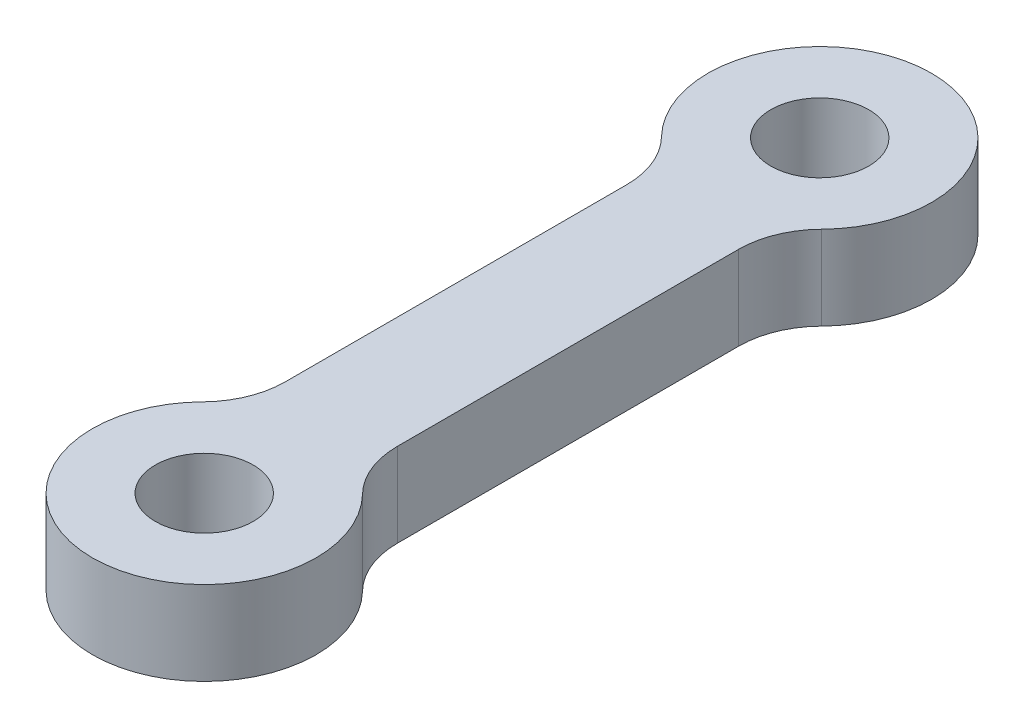
ISO-10303-21;
HEADER;
FILE_DESCRIPTION(('STEP AP214'),'2;1');
FILE_NAME('part.step','',(''),(''),'','','');
FILE_SCHEMA(('AUTOMOTIVE_DESIGN { 1 0 10303 214 1 1 1 1 }'));
ENDSEC;
DATA;
#1=APPLICATION_CONTEXT('core data for automotive mechanical design processes');
#2=APPLICATION_PROTOCOL_DEFINITION('international standard','automotive_design',2000,#1);
#3=PRODUCT_CONTEXT('',#1,'mechanical');
#4=PRODUCT('Part','Part','',(#3));
#5=PRODUCT_RELATED_PRODUCT_CATEGORY('part','',(#4));
#6=PRODUCT_DEFINITION_FORMATION('','',#4);
#7=PRODUCT_DEFINITION_CONTEXT('part definition',#1,'design');
#8=PRODUCT_DEFINITION('design','',#6,#7);
#9=PRODUCT_DEFINITION_SHAPE('','',#8);
#10=(LENGTH_UNIT() NAMED_UNIT(*) SI_UNIT(.MILLI.,.METRE.));
#11=(NAMED_UNIT(*) PLANE_ANGLE_UNIT() SI_UNIT($,.RADIAN.));
#12=(NAMED_UNIT(*) SI_UNIT($,.STERADIAN.) SOLID_ANGLE_UNIT());
#13=UNCERTAINTY_MEASURE_WITH_UNIT(LENGTH_MEASURE(1.E-05),#10,'distance_accuracy_value','');
#14=(GEOMETRIC_REPRESENTATION_CONTEXT(3) GLOBAL_UNCERTAINTY_ASSIGNED_CONTEXT((#13)) GLOBAL_UNIT_ASSIGNED_CONTEXT((#10,
#11,#12)) REPRESENTATION_CONTEXT('',''));
#15=CARTESIAN_POINT('',(0.,0.,0.));
#16=DIRECTION('',(0.,0.,1.));
#17=DIRECTION('',(1.,0.,0.));
#18=AXIS2_PLACEMENT_3D('',#15,#16,#17);
#19=CARTESIAN_POINT('',(2.,0.,0.));
#20=DIRECTION('',(1.,0.,0.));
#21=DIRECTION('',(0.,0.,-1.));
#22=AXIS2_PLACEMENT_3D('',#19,#20,#21);
#23=PLANE('',#22);
#24=DIRECTION('',(0.,0.,-1.));
#25=VECTOR('',#24,1.);
#26=CARTESIAN_POINT('',(2.,3.,0.));
#27=LINE('',#26,#25);
#28=CARTESIAN_POINT('',(2.,3.,-4.89897948556636));
#29=VERTEX_POINT('',#28);
#30=CARTESIAN_POINT('',(2.,3.,-17.1010205144336));
#31=VERTEX_POINT('',#30);
#32=EDGE_CURVE('E164',#29,#31,#27,.T.);
#33=ORIENTED_EDGE('',*,*,#32,.F.);
#34=DIRECTION('',(0.,-1.,0.));
#35=VECTOR('',#34,1.);
#36=CARTESIAN_POINT('',(2.,0.,-4.89897948556636));
#37=LINE('',#36,#35);
#38=CARTESIAN_POINT('',(2.,0.,-4.89897948556636));
#39=VERTEX_POINT('',#38);
#40=EDGE_CURVE('E138',#29,#39,#37,.T.);
#41=ORIENTED_EDGE('',*,*,#40,.T.);
#42=DIRECTION('',(0.,0.,-1.));
#43=VECTOR('',#42,1.);
#44=CARTESIAN_POINT('',(2.,0.,0.));
#45=LINE('',#44,#43);
#46=CARTESIAN_POINT('',(2.,0.,-17.1010205144336));
#47=VERTEX_POINT('',#46);
#48=EDGE_CURVE('E130',#39,#47,#45,.T.);
#49=ORIENTED_EDGE('',*,*,#48,.T.);
#50=DIRECTION('',(0.,-1.,0.));
#51=VECTOR('',#50,1.);
#52=CARTESIAN_POINT('',(2.,0.,-17.1010205144336));
#53=LINE('',#52,#51);
#54=EDGE_CURVE('E135',#47,#31,#53,.F.);
#55=ORIENTED_EDGE('',*,*,#54,.T.);
#56=EDGE_LOOP('',(#33,#41,#49,#55));
#57=FACE_BOUND('',#56,.T.);
#58=ADVANCED_FACE('F35',(#57),#23,.T.);
#59=CARTESIAN_POINT('',(-2.,0.,0.));
#60=DIRECTION('',(-1.,0.,0.));
#61=DIRECTION('',(0.,0.,1.));
#62=AXIS2_PLACEMENT_3D('',#59,#60,#61);
#63=PLANE('',#62);
#64=DIRECTION('',(0.,0.,1.));
#65=VECTOR('',#64,1.);
#66=CARTESIAN_POINT('',(-2.,0.,0.));
#67=LINE('',#66,#65);
#68=CARTESIAN_POINT('',(-2.,0.,-17.1010205144336));
#69=VERTEX_POINT('',#68);
#70=CARTESIAN_POINT('',(-2.,0.,-4.89897948556636));
#71=VERTEX_POINT('',#70);
#72=EDGE_CURVE('E127',#69,#71,#67,.T.);
#73=ORIENTED_EDGE('',*,*,#72,.T.);
#74=DIRECTION('',(0.,-1.,0.));
#75=VECTOR('',#74,1.);
#76=CARTESIAN_POINT('',(-2.,0.,-4.89897948556636));
#77=LINE('',#76,#75);
#78=CARTESIAN_POINT('',(-2.,3.,-4.89897948556636));
#79=VERTEX_POINT('',#78);
#80=EDGE_CURVE('E104',#71,#79,#77,.F.);
#81=ORIENTED_EDGE('',*,*,#80,.T.);
#82=DIRECTION('',(0.,0.,1.));
#83=VECTOR('',#82,1.);
#84=CARTESIAN_POINT('',(-2.,3.,0.));
#85=LINE('',#84,#83);
#86=CARTESIAN_POINT('',(-2.,3.,-17.1010205144336));
#87=VERTEX_POINT('',#86);
#88=EDGE_CURVE('E158',#87,#79,#85,.T.);
#89=ORIENTED_EDGE('',*,*,#88,.F.);
#90=DIRECTION('',(0.,-1.,0.));
#91=VECTOR('',#90,1.);
#92=CARTESIAN_POINT('',(-2.,0.,-17.1010205144336));
#93=LINE('',#92,#91);
#94=EDGE_CURVE('E140',#87,#69,#93,.T.);
#95=ORIENTED_EDGE('',*,*,#94,.T.);
#96=EDGE_LOOP('',(#73,#81,#89,#95));
#97=FACE_BOUND('',#96,.T.);
#98=ADVANCED_FACE('F163',(#97),#63,.T.);
#99=CARTESIAN_POINT('',(0.,3.,0.));
#100=DIRECTION('',(0.,-1.,0.));
#101=DIRECTION('',(0.,0.,-1.));
#102=AXIS2_PLACEMENT_3D('',#99,#100,#101);
#103=CYLINDRICAL_SURFACE('',#102,4.);
#104=CARTESIAN_POINT('',(0.,0.,0.));
#105=DIRECTION('',(0.,1.,0.));
#106=DIRECTION('',(0.,0.,1.));
#107=AXIS2_PLACEMENT_3D('',#104,#105,#106);
#108=CIRCLE('',#107,4.);
#109=CARTESIAN_POINT('',(-2.85714285714286,0.,-2.79941684889506));
#110=VERTEX_POINT('',#109);
#111=CARTESIAN_POINT('',(2.85714285714286,0.,-2.79941684889506));
#112=VERTEX_POINT('',#111);
#113=EDGE_CURVE('E117',#110,#112,#108,.T.);
#114=ORIENTED_EDGE('',*,*,#113,.T.);
#115=DIRECTION('',(0.,-1.,0.));
#116=VECTOR('',#115,1.);
#117=CARTESIAN_POINT('',(2.85714285714286,3.,-2.79941684889506));
#118=LINE('',#117,#116);
#119=CARTESIAN_POINT('',(2.85714285714286,3.,-2.79941684889506));
#120=VERTEX_POINT('',#119);
#121=EDGE_CURVE('E121',#112,#120,#118,.F.);
#122=ORIENTED_EDGE('',*,*,#121,.T.);
#123=CARTESIAN_POINT('',(0.,3.,0.));
#124=DIRECTION('',(0.,1.,0.));
#125=DIRECTION('',(0.,0.,1.));
#126=AXIS2_PLACEMENT_3D('',#123,#124,#125);
#127=CIRCLE('',#126,4.);
#128=CARTESIAN_POINT('',(-2.85714285714286,3.,-2.79941684889506));
#129=VERTEX_POINT('',#128);
#130=EDGE_CURVE('E120',#129,#120,#127,.T.);
#131=ORIENTED_EDGE('',*,*,#130,.F.);
#132=DIRECTION('',(0.,-1.,0.));
#133=VECTOR('',#132,1.);
#134=CARTESIAN_POINT('',(-2.85714285714286,3.,-2.79941684889506));
#135=LINE('',#134,#133);
#136=EDGE_CURVE('E103',#129,#110,#135,.T.);
#137=ORIENTED_EDGE('',*,*,#136,.T.);
#138=EDGE_LOOP('',(#114,#122,#131,#137));
#139=FACE_BOUND('',#138,.T.);
#140=ADVANCED_FACE('F115',(#139),#103,.T.);
#141=CARTESIAN_POINT('',(0.,3.,0.));
#142=DIRECTION('',(0.,1.,0.));
#143=DIRECTION('',(0.,0.,1.));
#144=AXIS2_PLACEMENT_3D('',#141,#142,#143);
#145=PLANE('',#144);
#146=CARTESIAN_POINT('',(0.,3.,0.));
#147=DIRECTION('',(0.,1.,0.));
#148=DIRECTION('',(0.,0.,1.));
#149=AXIS2_PLACEMENT_3D('',#146,#147,#148);
#150=CIRCLE('',#149,1.75);
#151=CARTESIAN_POINT('',(0.,3.,1.75));
#152=VERTEX_POINT('',#151);
#153=EDGE_CURVE('E281',#152,#152,#150,.T.);
#154=ORIENTED_EDGE('',*,*,#153,.F.);
#155=EDGE_LOOP('',(#154));
#156=FACE_BOUND('',#155,.T.);
#157=CARTESIAN_POINT('',(0.,3.,-22.));
#158=DIRECTION('',(0.,1.,0.));
#159=DIRECTION('',(0.,0.,1.));
#160=AXIS2_PLACEMENT_3D('',#157,#158,#159);
#161=CIRCLE('',#160,1.75);
#162=CARTESIAN_POINT('',(0.,3.,-20.25));
#163=VERTEX_POINT('',#162);
#164=EDGE_CURVE('E174',#163,#163,#161,.T.);
#165=ORIENTED_EDGE('',*,*,#164,.F.);
#166=EDGE_LOOP('',(#165));
#167=FACE_BOUND('',#166,.T.);
#168=ORIENTED_EDGE('',*,*,#32,.T.);
#169=CARTESIAN_POINT('',(5.,3.,-17.1010205144336));
#170=DIRECTION('',(0.,1.,0.));
#171=DIRECTION('',(0.,0.,1.));
#172=AXIS2_PLACEMENT_3D('',#169,#170,#171);
#173=CIRCLE('',#172,3.);
#174=CARTESIAN_POINT('',(2.85714285714286,3.,-19.2005831511049));
#175=VERTEX_POINT('',#174);
#176=EDGE_CURVE('E43',#31,#175,#173,.F.);
#177=ORIENTED_EDGE('',*,*,#176,.T.);
#178=CARTESIAN_POINT('',(0.,3.,-22.));
#179=DIRECTION('',(0.,1.,0.));
#180=DIRECTION('',(0.,0.,1.));
#181=AXIS2_PLACEMENT_3D('',#178,#179,#180);
#182=CIRCLE('',#181,4.);
#183=CARTESIAN_POINT('',(-2.85714285714286,3.,-19.2005831511049));
#184=VERTEX_POINT('',#183);
#185=EDGE_CURVE('E159',#175,#184,#182,.T.);
#186=ORIENTED_EDGE('',*,*,#185,.T.);
#187=CARTESIAN_POINT('',(-5.,3.,-17.1010205144336));
#188=DIRECTION('',(0.,1.,0.));
#189=DIRECTION('',(0.,0.,1.));
#190=AXIS2_PLACEMENT_3D('',#187,#188,#189);
#191=CIRCLE('',#190,3.);
#192=EDGE_CURVE('E153',#184,#87,#191,.F.);
#193=ORIENTED_EDGE('',*,*,#192,.T.);
#194=ORIENTED_EDGE('',*,*,#88,.T.);
#195=CARTESIAN_POINT('',(-5.,3.,-4.89897948556636));
#196=DIRECTION('',(0.,1.,0.));
#197=DIRECTION('',(0.,0.,1.));
#198=AXIS2_PLACEMENT_3D('',#195,#196,#197);
#199=CIRCLE('',#198,3.);
#200=EDGE_CURVE('E109',#79,#129,#199,.F.);
#201=ORIENTED_EDGE('',*,*,#200,.T.);
#202=ORIENTED_EDGE('',*,*,#130,.T.);
#203=CARTESIAN_POINT('',(5.,3.,-4.89897948556636));
#204=DIRECTION('',(0.,1.,0.));
#205=DIRECTION('',(0.,0.,1.));
#206=AXIS2_PLACEMENT_3D('',#203,#204,#205);
#207=CIRCLE('',#206,3.);
#208=EDGE_CURVE('E147',#120,#29,#207,.F.);
#209=ORIENTED_EDGE('',*,*,#208,.T.);
#210=EDGE_LOOP('',(#168,#177,#186,#193,#194,#201,#202,#209));
#211=FACE_BOUND('',#210,.T.);
#212=ADVANCED_FACE('F157',(#156,#167,#211),#145,.T.);
#213=CARTESIAN_POINT('',(0.,0.,0.));
#214=DIRECTION('',(0.,1.,0.));
#215=DIRECTION('',(0.,0.,1.));
#216=AXIS2_PLACEMENT_3D('',#213,#214,#215);
#217=PLANE('',#216);
#218=CARTESIAN_POINT('',(0.,0.,0.));
#219=DIRECTION('',(0.,1.,0.));
#220=DIRECTION('',(0.,0.,1.));
#221=AXIS2_PLACEMENT_3D('',#218,#219,#220);
#222=CIRCLE('',#221,1.75);
#223=CARTESIAN_POINT('',(0.,0.,1.75));
#224=VERTEX_POINT('',#223);
#225=EDGE_CURVE('E278',#224,#224,#222,.T.);
#226=ORIENTED_EDGE('',*,*,#225,.T.);
#227=EDGE_LOOP('',(#226));
#228=FACE_BOUND('',#227,.T.);
#229=CARTESIAN_POINT('',(0.,0.,-22.));
#230=DIRECTION('',(0.,1.,0.));
#231=DIRECTION('',(0.,0.,1.));
#232=AXIS2_PLACEMENT_3D('',#229,#230,#231);
#233=CIRCLE('',#232,1.75);
#234=CARTESIAN_POINT('',(0.,0.,-20.25));
#235=VERTEX_POINT('',#234);
#236=EDGE_CURVE('E170',#235,#235,#233,.T.);
#237=ORIENTED_EDGE('',*,*,#236,.T.);
#238=EDGE_LOOP('',(#237));
#239=FACE_BOUND('',#238,.T.);
#240=CARTESIAN_POINT('',(0.,0.,-22.));
#241=DIRECTION('',(0.,1.,0.));
#242=DIRECTION('',(0.,0.,1.));
#243=AXIS2_PLACEMENT_3D('',#240,#241,#242);
#244=CIRCLE('',#243,4.);
#245=CARTESIAN_POINT('',(2.85714285714286,0.,-19.2005831511049));
#246=VERTEX_POINT('',#245);
#247=CARTESIAN_POINT('',(-2.85714285714286,0.,-19.2005831511049));
#248=VERTEX_POINT('',#247);
#249=EDGE_CURVE('E166',#246,#248,#244,.T.);
#250=ORIENTED_EDGE('',*,*,#249,.F.);
#251=CARTESIAN_POINT('',(5.,0.,-17.1010205144336));
#252=DIRECTION('',(0.,1.,0.));
#253=DIRECTION('',(0.,0.,1.));
#254=AXIS2_PLACEMENT_3D('',#251,#252,#253);
#255=CIRCLE('',#254,3.);
#256=EDGE_CURVE('E11',#246,#47,#255,.T.);
#257=ORIENTED_EDGE('',*,*,#256,.T.);
#258=ORIENTED_EDGE('',*,*,#48,.F.);
#259=CARTESIAN_POINT('',(5.,0.,-4.89897948556636));
#260=DIRECTION('',(0.,1.,0.));
#261=DIRECTION('',(0.,0.,1.));
#262=AXIS2_PLACEMENT_3D('',#259,#260,#261);
#263=CIRCLE('',#262,3.);
#264=EDGE_CURVE('E110',#39,#112,#263,.T.);
#265=ORIENTED_EDGE('',*,*,#264,.T.);
#266=ORIENTED_EDGE('',*,*,#113,.F.);
#267=CARTESIAN_POINT('',(-5.,0.,-4.89897948556636));
#268=DIRECTION('',(0.,1.,0.));
#269=DIRECTION('',(0.,0.,1.));
#270=AXIS2_PLACEMENT_3D('',#267,#268,#269);
#271=CIRCLE('',#270,3.);
#272=EDGE_CURVE('E99',#110,#71,#271,.T.);
#273=ORIENTED_EDGE('',*,*,#272,.T.);
#274=ORIENTED_EDGE('',*,*,#72,.F.);
#275=CARTESIAN_POINT('',(-5.,0.,-17.1010205144336));
#276=DIRECTION('',(0.,1.,0.));
#277=DIRECTION('',(0.,0.,1.));
#278=AXIS2_PLACEMENT_3D('',#275,#276,#277);
#279=CIRCLE('',#278,3.);
#280=EDGE_CURVE('E151',#69,#248,#279,.T.);
#281=ORIENTED_EDGE('',*,*,#280,.T.);
#282=EDGE_LOOP('',(#250,#257,#258,#265,#266,#273,#274,#281));
#283=FACE_BOUND('',#282,.T.);
#284=ADVANCED_FACE('F124',(#228,#239,#283),#217,.F.);
#285=CARTESIAN_POINT('',(0.,3.,-22.));
#286=DIRECTION('',(0.,-1.,0.));
#287=DIRECTION('',(0.,0.,-1.));
#288=AXIS2_PLACEMENT_3D('',#285,#286,#287);
#289=CYLINDRICAL_SURFACE('',#288,4.);
#290=ORIENTED_EDGE('',*,*,#249,.T.);
#291=DIRECTION('',(0.,-1.,0.));
#292=VECTOR('',#291,1.);
#293=CARTESIAN_POINT('',(-2.85714285714286,3.,-19.2005831511049));
#294=LINE('',#293,#292);
#295=EDGE_CURVE('E50',#248,#184,#294,.F.);
#296=ORIENTED_EDGE('',*,*,#295,.T.);
#297=ORIENTED_EDGE('',*,*,#185,.F.);
#298=DIRECTION('',(0.,-1.,0.));
#299=VECTOR('',#298,1.);
#300=CARTESIAN_POINT('',(2.85714285714286,3.,-19.2005831511049));
#301=LINE('',#300,#299);
#302=EDGE_CURVE('E144',#175,#246,#301,.T.);
#303=ORIENTED_EDGE('',*,*,#302,.T.);
#304=EDGE_LOOP('',(#290,#296,#297,#303));
#305=FACE_BOUND('',#304,.T.);
#306=ADVANCED_FACE('F168',(#305),#289,.T.);
#307=CARTESIAN_POINT('',(5.,3.,-4.89897948556636));
#308=DIRECTION('',(0.,-1.,0.));
#309=DIRECTION('',(0.,0.,-1.));
#310=AXIS2_PLACEMENT_3D('',#307,#308,#309);
#311=CYLINDRICAL_SURFACE('',#310,3.);
#312=ORIENTED_EDGE('',*,*,#264,.F.);
#313=ORIENTED_EDGE('',*,*,#40,.F.);
#314=ORIENTED_EDGE('',*,*,#208,.F.);
#315=ORIENTED_EDGE('',*,*,#121,.F.);
#316=EDGE_LOOP('',(#312,#313,#314,#315));
#317=FACE_BOUND('',#316,.T.);
#318=ADVANCED_FACE('F185',(#317),#311,.F.);
#319=CARTESIAN_POINT('',(-5.,3.,-4.89897948556636));
#320=DIRECTION('',(0.,-1.,0.));
#321=DIRECTION('',(0.,0.,-1.));
#322=AXIS2_PLACEMENT_3D('',#319,#320,#321);
#323=CYLINDRICAL_SURFACE('',#322,3.);
#324=ORIENTED_EDGE('',*,*,#200,.F.);
#325=ORIENTED_EDGE('',*,*,#80,.F.);
#326=ORIENTED_EDGE('',*,*,#272,.F.);
#327=ORIENTED_EDGE('',*,*,#136,.F.);
#328=EDGE_LOOP('',(#324,#325,#326,#327));
#329=FACE_BOUND('',#328,.T.);
#330=ADVANCED_FACE('F102',(#329),#323,.F.);
#331=CARTESIAN_POINT('',(-5.,3.,-17.1010205144336));
#332=DIRECTION('',(0.,-1.,0.));
#333=DIRECTION('',(0.,0.,-1.));
#334=AXIS2_PLACEMENT_3D('',#331,#332,#333);
#335=CYLINDRICAL_SURFACE('',#334,3.);
#336=ORIENTED_EDGE('',*,*,#192,.F.);
#337=ORIENTED_EDGE('',*,*,#295,.F.);
#338=ORIENTED_EDGE('',*,*,#280,.F.);
#339=ORIENTED_EDGE('',*,*,#94,.F.);
#340=EDGE_LOOP('',(#336,#337,#338,#339));
#341=FACE_BOUND('',#340,.T.);
#342=ADVANCED_FACE('F165',(#341),#335,.F.);
#343=CARTESIAN_POINT('',(5.,3.,-17.1010205144336));
#344=DIRECTION('',(0.,-1.,0.));
#345=DIRECTION('',(0.,0.,-1.));
#346=AXIS2_PLACEMENT_3D('',#343,#344,#345);
#347=CYLINDRICAL_SURFACE('',#346,3.);
#348=ORIENTED_EDGE('',*,*,#256,.F.);
#349=ORIENTED_EDGE('',*,*,#302,.F.);
#350=ORIENTED_EDGE('',*,*,#176,.F.);
#351=ORIENTED_EDGE('',*,*,#54,.F.);
#352=EDGE_LOOP('',(#348,#349,#350,#351));
#353=FACE_BOUND('',#352,.T.);
#354=ADVANCED_FACE('F37',(#353),#347,.F.);
#355=CARTESIAN_POINT('',(0.,0.,-22.));
#356=DIRECTION('',(0.,1.,0.));
#357=DIRECTION('',(0.,0.,1.));
#358=AXIS2_PLACEMENT_3D('',#355,#356,#357);
#359=CYLINDRICAL_SURFACE('',#358,1.75);
#360=ORIENTED_EDGE('',*,*,#236,.F.);
#361=EDGE_LOOP('',(#360));
#362=FACE_BOUND('',#361,.T.);
#363=ORIENTED_EDGE('',*,*,#164,.T.);
#364=EDGE_LOOP('',(#363));
#365=FACE_BOUND('',#364,.T.);
#366=ADVANCED_FACE('F252',(#362,#365),#359,.F.);
#367=CARTESIAN_POINT('',(0.,0.,0.));
#368=DIRECTION('',(0.,1.,0.));
#369=DIRECTION('',(0.,0.,1.));
#370=AXIS2_PLACEMENT_3D('',#367,#368,#369);
#371=CYLINDRICAL_SURFACE('',#370,1.75);
#372=ORIENTED_EDGE('',*,*,#225,.F.);
#373=EDGE_LOOP('',(#372));
#374=FACE_BOUND('',#373,.T.);
#375=ORIENTED_EDGE('',*,*,#153,.T.);
#376=EDGE_LOOP('',(#375));
#377=FACE_BOUND('',#376,.T.);
#378=ADVANCED_FACE('F261',(#374,#377),#371,.F.);
#379=CLOSED_SHELL('',(#58,#98,#140,#212,#284,#306,#318,#330,#342,#354,#366,#378));
#380=MANIFOLD_SOLID_BREP('B2',#379);
#381=ADVANCED_BREP_SHAPE_REPRESENTATION('',(#18,#380),#14);
#382=SHAPE_DEFINITION_REPRESENTATION(#9,#381);
ENDSEC;
END-ISO-10303-21;
